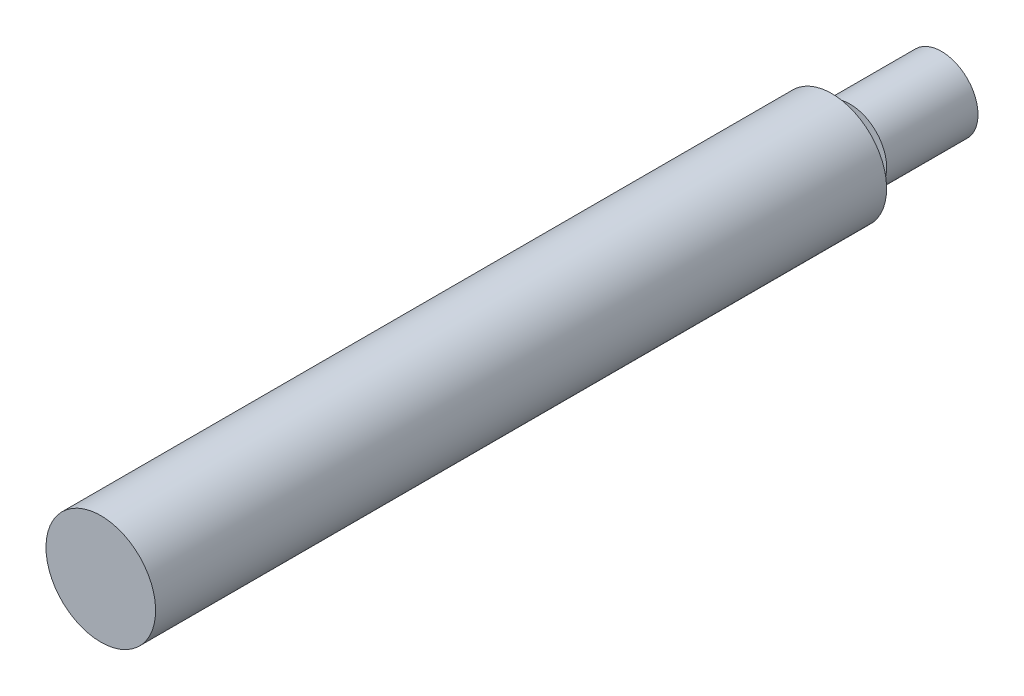
ISO-10303-21;
HEADER;
FILE_DESCRIPTION(('STEP AP214'),'2;1');
FILE_NAME('part.step','',(''),(''),'','','');
FILE_SCHEMA(('AUTOMOTIVE_DESIGN { 1 0 10303 214 1 1 1 1 }'));
ENDSEC;
DATA;
#1=APPLICATION_CONTEXT('core data for automotive mechanical design processes');
#2=APPLICATION_PROTOCOL_DEFINITION('international standard','automotive_design',2000,#1);
#3=PRODUCT_CONTEXT('',#1,'mechanical');
#4=PRODUCT('Part','Part','',(#3));
#5=PRODUCT_RELATED_PRODUCT_CATEGORY('part','',(#4));
#6=PRODUCT_DEFINITION_FORMATION('','',#4);
#7=PRODUCT_DEFINITION_CONTEXT('part definition',#1,'design');
#8=PRODUCT_DEFINITION('design','',#6,#7);
#9=PRODUCT_DEFINITION_SHAPE('','',#8);
#10=(LENGTH_UNIT() NAMED_UNIT(*) SI_UNIT(.MILLI.,.METRE.));
#11=(NAMED_UNIT(*) PLANE_ANGLE_UNIT() SI_UNIT($,.RADIAN.));
#12=(NAMED_UNIT(*) SI_UNIT($,.STERADIAN.) SOLID_ANGLE_UNIT());
#13=UNCERTAINTY_MEASURE_WITH_UNIT(LENGTH_MEASURE(1.E-05),#10,'distance_accuracy_value','');
#14=(GEOMETRIC_REPRESENTATION_CONTEXT(3) GLOBAL_UNCERTAINTY_ASSIGNED_CONTEXT((#13)) GLOBAL_UNIT_ASSIGNED_CONTEXT((#10,
#11,#12)) REPRESENTATION_CONTEXT('',''));
#15=CARTESIAN_POINT('',(0.,0.,0.));
#16=DIRECTION('',(0.,0.,1.));
#17=DIRECTION('',(1.,0.,0.));
#18=AXIS2_PLACEMENT_3D('',#15,#16,#17);
#19=CARTESIAN_POINT('',(0.,0.,-6.));
#20=DIRECTION('',(0.,0.,1.));
#21=DIRECTION('',(0.,-1.,0.));
#22=AXIS2_PLACEMENT_3D('',#19,#20,#21);
#23=PLANE('',#22);
#24=CARTESIAN_POINT('',(0.,0.,-6.));
#25=DIRECTION('',(0.,0.,1.));
#26=DIRECTION('',(0.,-1.,0.));
#27=AXIS2_PLACEMENT_3D('',#24,#25,#26);
#28=CIRCLE('',#27,2.00000000000001);
#29=CARTESIAN_POINT('',(0.,-2.00000000000005,-5.99999999999998));
#30=VERTEX_POINT('',#29);
#31=EDGE_CURVE('E10',#30,#30,#28,.T.);
#32=ORIENTED_EDGE('',*,*,#31,.F.);
#33=EDGE_LOOP('',(#32));
#34=FACE_BOUND('',#33,.T.);
#35=ADVANCED_FACE('F41',(#34),#23,.F.);
#36=CARTESIAN_POINT('',(0.,3.02086212207189E-13,44.6812413574794));
#37=DIRECTION('',(0.,0.,1.));
#38=DIRECTION('',(0.,-1.,0.));
#39=AXIS2_PLACEMENT_3D('',#36,#37,#38);
#40=CYLINDRICAL_SURFACE('',#39,2.);
#41=CARTESIAN_POINT('',(0.,0.,-1.));
#42=DIRECTION('',(0.,0.,1.));
#43=DIRECTION('',(0.,-1.,0.));
#44=AXIS2_PLACEMENT_3D('',#41,#42,#43);
#45=CIRCLE('',#44,2.);
#46=CARTESIAN_POINT('',(0.,-2.00000000000001,-0.999999999999987));
#47=VERTEX_POINT('',#46);
#48=EDGE_CURVE('E48',#47,#47,#45,.T.);
#49=ORIENTED_EDGE('',*,*,#48,.F.);
#50=EDGE_LOOP('',(#49));
#51=FACE_BOUND('',#50,.T.);
#52=ORIENTED_EDGE('',*,*,#31,.T.);
#53=EDGE_LOOP('',(#52));
#54=FACE_BOUND('',#53,.T.);
#55=ADVANCED_FACE('F95',(#51,#54),#40,.T.);
#56=CARTESIAN_POINT('',(2.,0.,-1.));
#57=DIRECTION('',(0.,0.,-1.));
#58=DIRECTION('',(0.,1.,0.));
#59=AXIS2_PLACEMENT_3D('',#56,#57,#58);
#60=PLANE('',#59);
#61=CARTESIAN_POINT('',(0.,0.,-1.));
#62=DIRECTION('',(0.,0.,1.));
#63=DIRECTION('',(0.,-1.,0.));
#64=AXIS2_PLACEMENT_3D('',#61,#62,#63);
#65=CIRCLE('',#64,1.5);
#66=CARTESIAN_POINT('',(0.,-1.50000000000001,-0.999999999999991));
#67=VERTEX_POINT('',#66);
#68=EDGE_CURVE('E53',#67,#67,#65,.T.);
#69=ORIENTED_EDGE('',*,*,#68,.F.);
#70=EDGE_LOOP('',(#69));
#71=FACE_BOUND('',#70,.T.);
#72=ORIENTED_EDGE('',*,*,#48,.T.);
#73=EDGE_LOOP('',(#72));
#74=FACE_BOUND('',#73,.T.);
#75=ADVANCED_FACE('F90',(#71,#74),#60,.F.);
#76=CARTESIAN_POINT('',(0.,3.02086212207189E-13,44.6812413574794));
#77=DIRECTION('',(0.,0.,1.));
#78=DIRECTION('',(0.,-1.,0.));
#79=AXIS2_PLACEMENT_3D('',#76,#77,#78);
#80=CYLINDRICAL_SURFACE('',#79,1.5);
#81=CARTESIAN_POINT('',(0.,0.,0.));
#82=DIRECTION('',(0.,0.,1.));
#83=DIRECTION('',(0.,-1.,0.));
#84=AXIS2_PLACEMENT_3D('',#81,#82,#83);
#85=CIRCLE('',#84,1.5);
#86=CARTESIAN_POINT('',(0.,-1.5,0.));
#87=VERTEX_POINT('',#86);
#88=EDGE_CURVE('E58',#87,#87,#85,.T.);
#89=ORIENTED_EDGE('',*,*,#88,.F.);
#90=EDGE_LOOP('',(#89));
#91=FACE_BOUND('',#90,.T.);
#92=ORIENTED_EDGE('',*,*,#68,.T.);
#93=EDGE_LOOP('',(#92));
#94=FACE_BOUND('',#93,.T.);
#95=ADVANCED_FACE('F84',(#91,#94),#80,.T.);
#96=CARTESIAN_POINT('',(3.00000000000002,0.,0.));
#97=DIRECTION('',(0.,0.,1.));
#98=DIRECTION('',(0.,-1.,0.));
#99=AXIS2_PLACEMENT_3D('',#96,#97,#98);
#100=PLANE('',#99);
#101=CARTESIAN_POINT('',(0.,0.,0.));
#102=DIRECTION('',(0.,0.,1.));
#103=DIRECTION('',(0.,-1.,0.));
#104=AXIS2_PLACEMENT_3D('',#101,#102,#103);
#105=CIRCLE('',#104,3.00000000000001);
#106=CARTESIAN_POINT('',(0.,-3.00000000000001,0.));
#107=VERTEX_POINT('',#106);
#108=EDGE_CURVE('E64',#107,#107,#105,.T.);
#109=ORIENTED_EDGE('',*,*,#108,.F.);
#110=EDGE_LOOP('',(#109));
#111=FACE_BOUND('',#110,.T.);
#112=ORIENTED_EDGE('',*,*,#88,.T.);
#113=EDGE_LOOP('',(#112));
#114=FACE_BOUND('',#113,.T.);
#115=ADVANCED_FACE('F78',(#111,#114),#100,.F.);
#116=CARTESIAN_POINT('',(0.,3.02086212207189E-13,44.6812413574794));
#117=DIRECTION('',(0.,0.,1.));
#118=DIRECTION('',(0.,-1.,0.));
#119=AXIS2_PLACEMENT_3D('',#116,#117,#118);
#120=CYLINDRICAL_SURFACE('',#119,3.00000000000001);
#121=CARTESIAN_POINT('',(0.,2.70436722910449E-13,40.));
#122=DIRECTION('',(0.,0.,1.));
#123=DIRECTION('',(0.,-1.,0.));
#124=AXIS2_PLACEMENT_3D('',#121,#122,#123);
#125=CIRCLE('',#124,3.);
#126=CARTESIAN_POINT('',(0.,-2.99999999999973,40.));
#127=VERTEX_POINT('',#126);
#128=EDGE_CURVE('E68',#127,#127,#125,.T.);
#129=ORIENTED_EDGE('',*,*,#128,.F.);
#130=EDGE_LOOP('',(#129));
#131=FACE_BOUND('',#130,.T.);
#132=ORIENTED_EDGE('',*,*,#108,.T.);
#133=EDGE_LOOP('',(#132));
#134=FACE_BOUND('',#133,.T.);
#135=ADVANCED_FACE('F75',(#131,#134),#120,.T.);
#136=CARTESIAN_POINT('',(0.,2.70436722910449E-13,40.));
#137=DIRECTION('',(0.,0.,-1.));
#138=DIRECTION('',(0.,1.,0.));
#139=AXIS2_PLACEMENT_3D('',#136,#137,#138);
#140=PLANE('',#139);
#141=ORIENTED_EDGE('',*,*,#128,.T.);
#142=EDGE_LOOP('',(#141));
#143=FACE_BOUND('',#142,.T.);
#144=ADVANCED_FACE('F73',(#143),#140,.F.);
#145=CLOSED_SHELL('',(#35,#55,#75,#95,#115,#135,#144));
#146=MANIFOLD_SOLID_BREP('B2',#145);
#147=ADVANCED_BREP_SHAPE_REPRESENTATION('',(#18,#146),#14);
#148=SHAPE_DEFINITION_REPRESENTATION(#9,#147);
ENDSEC;
END-ISO-10303-21;
